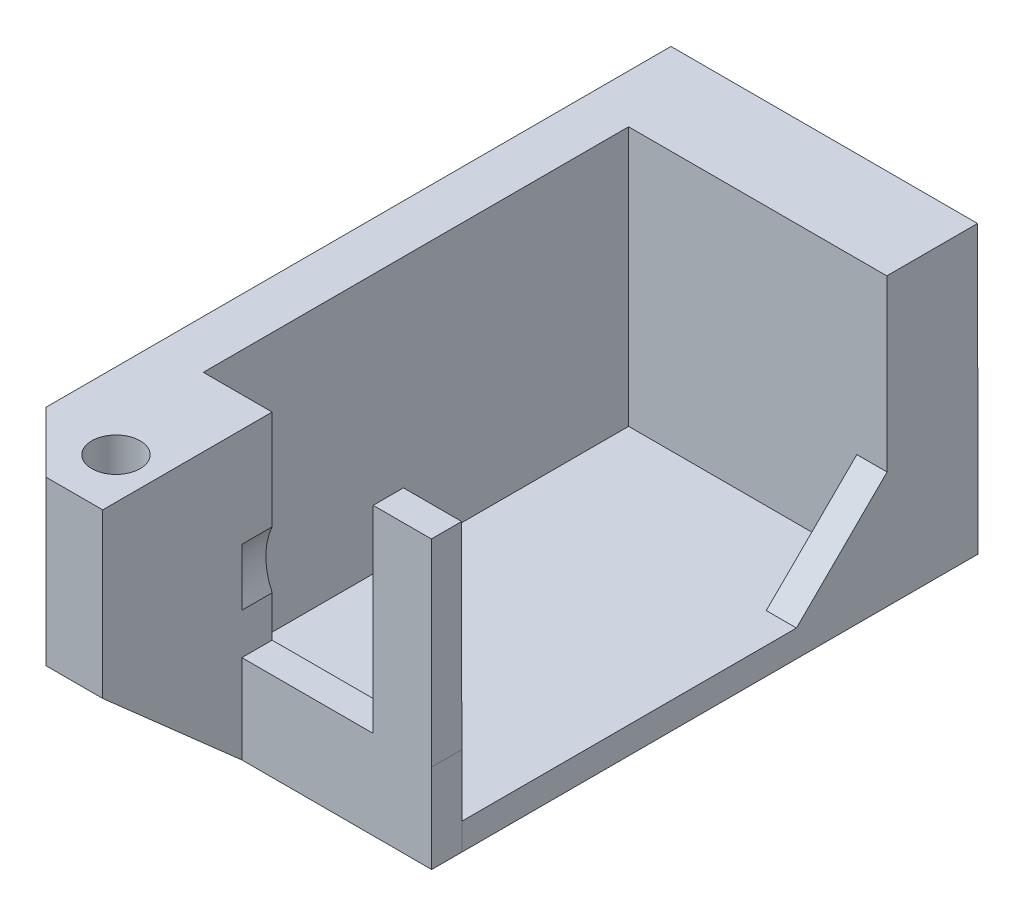
ISO-10303-21;
HEADER;
FILE_DESCRIPTION(('STEP AP214'),'2;1');
FILE_NAME('part.step','',(''),(''),'','','');
FILE_SCHEMA(('AUTOMOTIVE_DESIGN { 1 0 10303 214 1 1 1 1 }'));
ENDSEC;
DATA;
#1=APPLICATION_CONTEXT('core data for automotive mechanical design processes');
#2=APPLICATION_PROTOCOL_DEFINITION('international standard','automotive_design',2000,#1);
#3=PRODUCT_CONTEXT('',#1,'mechanical');
#4=PRODUCT('Part','Part','',(#3));
#5=PRODUCT_RELATED_PRODUCT_CATEGORY('part','',(#4));
#6=PRODUCT_DEFINITION_FORMATION('','',#4);
#7=PRODUCT_DEFINITION_CONTEXT('part definition',#1,'design');
#8=PRODUCT_DEFINITION('design','',#6,#7);
#9=PRODUCT_DEFINITION_SHAPE('','',#8);
#10=(LENGTH_UNIT() NAMED_UNIT(*) SI_UNIT(.MILLI.,.METRE.));
#11=(NAMED_UNIT(*) PLANE_ANGLE_UNIT() SI_UNIT($,.RADIAN.));
#12=(NAMED_UNIT(*) SI_UNIT($,.STERADIAN.) SOLID_ANGLE_UNIT());
#13=UNCERTAINTY_MEASURE_WITH_UNIT(LENGTH_MEASURE(1.E-05),#10,'distance_accuracy_value','');
#14=(GEOMETRIC_REPRESENTATION_CONTEXT(3) GLOBAL_UNCERTAINTY_ASSIGNED_CONTEXT((#13)) GLOBAL_UNIT_ASSIGNED_CONTEXT((#10,
#11,#12)) REPRESENTATION_CONTEXT('',''));
#15=CARTESIAN_POINT('',(0.,0.,0.));
#16=DIRECTION('',(0.,0.,1.));
#17=DIRECTION('',(1.,0.,0.));
#18=AXIS2_PLACEMENT_3D('',#15,#16,#17);
#19=CARTESIAN_POINT('',(0.,0.,0.));
#20=DIRECTION('',(0.,0.,-1.));
#21=DIRECTION('',(-1.,0.,0.));
#22=AXIS2_PLACEMENT_3D('',#19,#20,#21);
#23=PLANE('',#22);
#24=DIRECTION('',(1.,0.,0.));
#25=VECTOR('',#24,1.);
#26=CARTESIAN_POINT('',(-21.5750956135343,-21.7319684577006,0.));
#27=LINE('',#26,#25);
#28=CARTESIAN_POINT('',(-21.5750956135343,-21.7319684577006,0.));
#29=VERTEX_POINT('',#28);
#30=CARTESIAN_POINT('',(21.1677923545201,-21.7319684577006,0.));
#31=VERTEX_POINT('',#30);
#32=EDGE_CURVE('E317',#29,#31,#27,.T.);
#33=ORIENTED_EDGE('',*,*,#32,.F.);
#34=DIRECTION('',(0.,-1.,0.));
#35=VECTOR('',#34,1.);
#36=CARTESIAN_POINT('',(-21.5750956135343,21.15,0.));
#37=LINE('',#36,#35);
#38=CARTESIAN_POINT('',(-21.5750956135343,21.15,0.));
#39=VERTEX_POINT('',#38);
#40=EDGE_CURVE('E322',#39,#29,#37,.T.);
#41=ORIENTED_EDGE('',*,*,#40,.F.);
#42=DIRECTION('',(-1.,0.,0.));
#43=VECTOR('',#42,1.);
#44=CARTESIAN_POINT('',(-10.2002053653351,21.15,0.));
#45=LINE('',#44,#43);
#46=CARTESIAN_POINT('',(-10.2002053653351,21.15,0.));
#47=VERTEX_POINT('',#46);
#48=EDGE_CURVE('E249',#47,#39,#45,.T.);
#49=ORIENTED_EDGE('',*,*,#48,.F.);
#50=DIRECTION('',(0.,1.,0.));
#51=VECTOR('',#50,1.);
#52=CARTESIAN_POINT('',(-10.2002053653351,4.72173150604771,0.));
#53=LINE('',#52,#51);
#54=CARTESIAN_POINT('',(-10.2002053653351,4.72173150604772,0.));
#55=VERTEX_POINT('',#54);
#56=EDGE_CURVE('E253',#55,#47,#53,.T.);
#57=ORIENTED_EDGE('',*,*,#56,.F.);
#58=CARTESIAN_POINT('',(0.,0.,0.));
#59=DIRECTION('',(0.,0.,-1.));
#60=DIRECTION('',(-1.,0.,0.));
#61=AXIS2_PLACEMENT_3D('',#58,#59,#60);
#62=CIRCLE('',#61,11.2400595154213);
#63=CARTESIAN_POINT('',(-10.2002053653351,-4.72173150604771,0.));
#64=VERTEX_POINT('',#63);
#65=EDGE_CURVE('E255',#64,#55,#62,.T.);
#66=ORIENTED_EDGE('',*,*,#65,.F.);
#67=DIRECTION('',(0.,1.,0.));
#68=VECTOR('',#67,1.);
#69=CARTESIAN_POINT('',(-10.2002053653351,-11.5,0.));
#70=LINE('',#69,#68);
#71=CARTESIAN_POINT('',(-10.2002053653351,-11.5,0.));
#72=VERTEX_POINT('',#71);
#73=EDGE_CURVE('E257',#72,#64,#70,.T.);
#74=ORIENTED_EDGE('',*,*,#73,.F.);
#75=DIRECTION('',(-1.,0.,0.));
#76=VECTOR('',#75,1.);
#77=CARTESIAN_POINT('',(-10.2002053653351,-11.5,0.));
#78=LINE('',#77,#76);
#79=CARTESIAN_POINT('',(11.5,-11.5,0.));
#80=VERTEX_POINT('',#79);
#81=EDGE_CURVE('E259',#80,#72,#78,.T.);
#82=ORIENTED_EDGE('',*,*,#81,.F.);
#83=DIRECTION('',(0.,-1.,0.));
#84=VECTOR('',#83,1.);
#85=CARTESIAN_POINT('',(11.5,-11.5,0.));
#86=LINE('',#85,#84);
#87=CARTESIAN_POINT('',(11.5,21.15,0.));
#88=VERTEX_POINT('',#87);
#89=EDGE_CURVE('E261',#88,#80,#86,.T.);
#90=ORIENTED_EDGE('',*,*,#89,.F.);
#91=DIRECTION('',(-1.,0.,0.));
#92=VECTOR('',#91,1.);
#93=CARTESIAN_POINT('',(11.5,21.15,0.));
#94=LINE('',#93,#92);
#95=CARTESIAN_POINT('',(21.124259995829,21.15,0.));
#96=VERTEX_POINT('',#95);
#97=EDGE_CURVE('E263',#96,#88,#94,.T.);
#98=ORIENTED_EDGE('',*,*,#97,.F.);
#99=DIRECTION('',(-0.000780240586579401,0.999999695612267,0.));
#100=VECTOR('',#99,1.);
#101=CARTESIAN_POINT('',(21.124259995829,21.15,0.));
#102=LINE('',#101,#100);
#103=CARTESIAN_POINT('',(21.149734858735,-11.5,0.));
#104=VERTEX_POINT('',#103);
#105=EDGE_CURVE('E265',#104,#96,#102,.T.);
#106=ORIENTED_EDGE('',*,*,#105,.F.);
#107=DIRECTION('',(-1.,1.30852772091248E-11,0.));
#108=VECTOR('',#107,1.);
#109=CARTESIAN_POINT('',(21.15,-11.5,0.));
#110=LINE('',#109,#108);
#111=CARTESIAN_POINT('',(21.15,-11.5,0.));
#112=VERTEX_POINT('',#111);
#113=EDGE_CURVE('E267',#112,#104,#110,.T.);
#114=ORIENTED_EDGE('',*,*,#113,.F.);
#115=DIRECTION('',(-0.00173889586287371,0.999998488119446,0.));
#116=VECTOR('',#115,1.);
#117=CARTESIAN_POINT('',(21.1754748629061,-26.15,0.));
#118=LINE('',#117,#116);
#119=EDGE_CURVE('E272',#31,#112,#118,.T.);
#120=ORIENTED_EDGE('',*,*,#119,.F.);
#121=EDGE_LOOP('',(#33,#41,#49,#57,#66,#74,#82,#90,#98,#106,#114,#120));
#122=FACE_BOUND('',#121,.T.);
#123=ADVANCED_FACE('F33',(#122),#23,.T.);
#124=CARTESIAN_POINT('',(21.1754748629061,-26.15,5.));
#125=DIRECTION('',(-0.999998488119446,-0.00173889586287371,0.));
#126=DIRECTION('',(0.00173889586287371,-0.999998488119446,0.));
#127=AXIS2_PLACEMENT_3D('',#124,#125,#126);
#128=PLANE('',#127);
#129=CARTESIAN_POINT('',(21.1754748629061,-26.15,0.));
#130=VERTEX_POINT('',#129);
#131=EDGE_CURVE('E269',#130,#31,#118,.T.);
#132=ORIENTED_EDGE('',*,*,#131,.T.);
#133=ORIENTED_EDGE('',*,*,#119,.T.);
#134=DIRECTION('',(0.,0.,-1.));
#135=VECTOR('',#134,1.);
#136=CARTESIAN_POINT('',(21.15,-11.5,5.));
#137=LINE('',#136,#135);
#138=CARTESIAN_POINT('',(21.15,-11.5,5.));
#139=VERTEX_POINT('',#138);
#140=EDGE_CURVE('E214',#139,#112,#137,.T.);
#141=ORIENTED_EDGE('',*,*,#140,.F.);
#142=DIRECTION('',(-0.00173889586287371,0.999998488119446,0.));
#143=VECTOR('',#142,1.);
#144=CARTESIAN_POINT('',(21.1754748629061,-26.15,5.));
#145=LINE('',#144,#143);
#146=CARTESIAN_POINT('',(21.1754748629061,-26.15,5.));
#147=VERTEX_POINT('',#146);
#148=EDGE_CURVE('E252',#147,#139,#145,.T.);
#149=ORIENTED_EDGE('',*,*,#148,.F.);
#150=DIRECTION('',(0.,0.,-1.));
#151=VECTOR('',#150,1.);
#152=CARTESIAN_POINT('',(21.1754748629061,-26.15,5.));
#153=LINE('',#152,#151);
#154=EDGE_CURVE('E245',#147,#130,#153,.T.);
#155=ORIENTED_EDGE('',*,*,#154,.T.);
#156=EDGE_LOOP('',(#132,#133,#141,#149,#155));
#157=FACE_BOUND('',#156,.T.);
#158=ADVANCED_FACE('F368',(#157),#128,.F.);
#159=CARTESIAN_POINT('',(21.15,-11.5,5.));
#160=DIRECTION('',(-1.30852772091248E-11,-1.,0.));
#161=DIRECTION('',(1.,-1.30852772091248E-11,0.));
#162=AXIS2_PLACEMENT_3D('',#159,#160,#161);
#163=PLANE('',#162);
#164=ORIENTED_EDGE('',*,*,#113,.T.);
#165=DIRECTION('',(0.,0.,-1.));
#166=VECTOR('',#165,1.);
#167=CARTESIAN_POINT('',(21.149734858735,-11.5,5.));
#168=LINE('',#167,#166);
#169=CARTESIAN_POINT('',(21.149734858735,-11.5,5.));
#170=VERTEX_POINT('',#169);
#171=EDGE_CURVE('E217',#170,#104,#168,.T.);
#172=ORIENTED_EDGE('',*,*,#171,.F.);
#173=DIRECTION('',(-1.,1.30852772091248E-11,0.));
#174=VECTOR('',#173,1.);
#175=CARTESIAN_POINT('',(21.15,-11.5,5.));
#176=LINE('',#175,#174);
#177=EDGE_CURVE('E287',#139,#170,#176,.T.);
#178=ORIENTED_EDGE('',*,*,#177,.F.);
#179=ORIENTED_EDGE('',*,*,#140,.T.);
#180=EDGE_LOOP('',(#164,#172,#178,#179));
#181=FACE_BOUND('',#180,.T.);
#182=ADVANCED_FACE('F389',(#181),#163,.F.);
#183=CARTESIAN_POINT('',(21.124259995829,21.15,5.));
#184=DIRECTION('',(-0.999999695612267,-0.000780240586579401,0.));
#185=DIRECTION('',(0.000780240586579401,-0.999999695612267,0.));
#186=AXIS2_PLACEMENT_3D('',#183,#184,#185);
#187=PLANE('',#186);
#188=ORIENTED_EDGE('',*,*,#105,.T.);
#189=DIRECTION('',(0.,0.,-1.));
#190=VECTOR('',#189,1.);
#191=CARTESIAN_POINT('',(21.124259995829,21.15,5.));
#192=LINE('',#191,#190);
#193=CARTESIAN_POINT('',(21.124259995829,21.15,5.));
#194=VERTEX_POINT('',#193);
#195=EDGE_CURVE('E220',#194,#96,#192,.T.);
#196=ORIENTED_EDGE('',*,*,#195,.F.);
#197=DIRECTION('',(-0.000780240586579401,0.999999695612267,0.));
#198=VECTOR('',#197,1.);
#199=CARTESIAN_POINT('',(21.124259995829,21.15,5.));
#200=LINE('',#199,#198);
#201=EDGE_CURVE('E285',#170,#194,#200,.T.);
#202=ORIENTED_EDGE('',*,*,#201,.F.);
#203=ORIENTED_EDGE('',*,*,#171,.T.);
#204=EDGE_LOOP('',(#188,#196,#202,#203));
#205=FACE_BOUND('',#204,.T.);
#206=ADVANCED_FACE('F447',(#205),#187,.F.);
#207=CARTESIAN_POINT('',(11.5,21.15,5.));
#208=DIRECTION('',(0.,-1.,0.));
#209=DIRECTION('',(0.,0.,-1.));
#210=AXIS2_PLACEMENT_3D('',#207,#208,#209);
#211=PLANE('',#210);
#212=ORIENTED_EDGE('',*,*,#97,.T.);
#213=DIRECTION('',(0.,0.,-1.));
#214=VECTOR('',#213,1.);
#215=CARTESIAN_POINT('',(11.5,21.15,5.));
#216=LINE('',#215,#214);
#217=CARTESIAN_POINT('',(11.5,21.15,5.));
#218=VERTEX_POINT('',#217);
#219=EDGE_CURVE('E223',#218,#88,#216,.T.);
#220=ORIENTED_EDGE('',*,*,#219,.F.);
#221=DIRECTION('',(-1.,0.,0.));
#222=VECTOR('',#221,1.);
#223=CARTESIAN_POINT('',(11.5,21.15,5.));
#224=LINE('',#223,#222);
#225=EDGE_CURVE('E283',#194,#218,#224,.T.);
#226=ORIENTED_EDGE('',*,*,#225,.F.);
#227=ORIENTED_EDGE('',*,*,#195,.T.);
#228=EDGE_LOOP('',(#212,#220,#226,#227));
#229=FACE_BOUND('',#228,.T.);
#230=ADVANCED_FACE('F443',(#229),#211,.F.);
#231=CARTESIAN_POINT('',(11.5,-11.5,5.));
#232=DIRECTION('',(1.,0.,0.));
#233=DIRECTION('',(0.,0.,-1.));
#234=AXIS2_PLACEMENT_3D('',#231,#232,#233);
#235=PLANE('',#234);
#236=ORIENTED_EDGE('',*,*,#89,.T.);
#237=DIRECTION('',(0.,0.,-1.));
#238=VECTOR('',#237,1.);
#239=CARTESIAN_POINT('',(11.5,-11.5,5.));
#240=LINE('',#239,#238);
#241=CARTESIAN_POINT('',(11.5,-11.5,5.));
#242=VERTEX_POINT('',#241);
#243=EDGE_CURVE('E226',#242,#80,#240,.T.);
#244=ORIENTED_EDGE('',*,*,#243,.F.);
#245=DIRECTION('',(0.,-1.,0.));
#246=VECTOR('',#245,1.);
#247=CARTESIAN_POINT('',(11.5,-11.5,5.));
#248=LINE('',#247,#246);
#249=EDGE_CURVE('E281',#218,#242,#248,.T.);
#250=ORIENTED_EDGE('',*,*,#249,.F.);
#251=ORIENTED_EDGE('',*,*,#219,.T.);
#252=EDGE_LOOP('',(#236,#244,#250,#251));
#253=FACE_BOUND('',#252,.T.);
#254=ADVANCED_FACE('F439',(#253),#235,.F.);
#255=CARTESIAN_POINT('',(-10.2002053653351,-11.5,5.));
#256=DIRECTION('',(0.,-1.,0.));
#257=DIRECTION('',(0.,0.,-1.));
#258=AXIS2_PLACEMENT_3D('',#255,#256,#257);
#259=PLANE('',#258);
#260=ORIENTED_EDGE('',*,*,#81,.T.);
#261=DIRECTION('',(0.,0.,-1.));
#262=VECTOR('',#261,1.);
#263=CARTESIAN_POINT('',(-10.2002053653351,-11.5,5.));
#264=LINE('',#263,#262);
#265=CARTESIAN_POINT('',(-10.2002053653351,-11.5,5.));
#266=VERTEX_POINT('',#265);
#267=EDGE_CURVE('E229',#266,#72,#264,.T.);
#268=ORIENTED_EDGE('',*,*,#267,.F.);
#269=DIRECTION('',(-1.,0.,0.));
#270=VECTOR('',#269,1.);
#271=CARTESIAN_POINT('',(-10.2002053653351,-11.5,5.));
#272=LINE('',#271,#270);
#273=EDGE_CURVE('E279',#242,#266,#272,.T.);
#274=ORIENTED_EDGE('',*,*,#273,.F.);
#275=ORIENTED_EDGE('',*,*,#243,.T.);
#276=EDGE_LOOP('',(#260,#268,#274,#275));
#277=FACE_BOUND('',#276,.T.);
#278=ADVANCED_FACE('F435',(#277),#259,.F.);
#279=CARTESIAN_POINT('',(0.,0.,5.));
#280=DIRECTION('',(0.,0.,-1.));
#281=DIRECTION('',(-1.,0.,0.));
#282=AXIS2_PLACEMENT_3D('',#279,#280,#281);
#283=CYLINDRICAL_SURFACE('',#282,11.2400595154213);
#284=ORIENTED_EDGE('',*,*,#65,.T.);
#285=DIRECTION('',(0.,0.,-1.));
#286=VECTOR('',#285,1.);
#287=CARTESIAN_POINT('',(-10.2002053653351,4.72173150604772,5.));
#288=LINE('',#287,#286);
#289=CARTESIAN_POINT('',(-10.2002053653351,4.72173150604772,5.));
#290=VERTEX_POINT('',#289);
#291=EDGE_CURVE('E235',#290,#55,#288,.T.);
#292=ORIENTED_EDGE('',*,*,#291,.F.);
#293=CARTESIAN_POINT('',(0.,0.,5.));
#294=DIRECTION('',(0.,0.,-1.));
#295=DIRECTION('',(-1.,0.,0.));
#296=AXIS2_PLACEMENT_3D('',#293,#294,#295);
#297=CIRCLE('',#296,11.2400595154213);
#298=CARTESIAN_POINT('',(-10.2002053653351,-4.72173150604771,5.));
#299=VERTEX_POINT('',#298);
#300=EDGE_CURVE('E276',#299,#290,#297,.T.);
#301=ORIENTED_EDGE('',*,*,#300,.F.);
#302=DIRECTION('',(0.,0.,-1.));
#303=VECTOR('',#302,1.);
#304=CARTESIAN_POINT('',(-10.2002053653351,-4.72173150604771,5.));
#305=LINE('',#304,#303);
#306=EDGE_CURVE('E232',#299,#64,#305,.T.);
#307=ORIENTED_EDGE('',*,*,#306,.T.);
#308=EDGE_LOOP('',(#284,#292,#301,#307));
#309=FACE_BOUND('',#308,.T.);
#310=ADVANCED_FACE('F432',(#309),#283,.F.);
#311=CARTESIAN_POINT('',(-10.2002053653351,4.72173150604771,5.));
#312=DIRECTION('',(-1.,0.,0.));
#313=DIRECTION('',(0.,-1.,0.));
#314=AXIS2_PLACEMENT_3D('',#311,#312,#313);
#315=PLANE('',#314);
#316=ORIENTED_EDGE('',*,*,#56,.T.);
#317=DIRECTION('',(0.,0.,-1.));
#318=VECTOR('',#317,1.);
#319=CARTESIAN_POINT('',(-10.2002053653351,21.15,5.));
#320=LINE('',#319,#318);
#321=CARTESIAN_POINT('',(-10.2002053653351,21.15,28.));
#322=VERTEX_POINT('',#321);
#323=EDGE_CURVE('E238',#322,#47,#320,.T.);
#324=ORIENTED_EDGE('',*,*,#323,.F.);
#325=DIRECTION('',(0.,1.,0.));
#326=VECTOR('',#325,1.);
#327=CARTESIAN_POINT('',(-10.2002053653351,21.15,28.));
#328=LINE('',#327,#326);
#329=CARTESIAN_POINT('',(-10.2002053653351,-5.85,28.));
#330=VERTEX_POINT('',#329);
#331=EDGE_CURVE('E294',#330,#322,#328,.T.);
#332=ORIENTED_EDGE('',*,*,#331,.F.);
#333=DIRECTION('',(0.,0.661729443022599,0.749742718695555));
#334=VECTOR('',#333,1.);
#335=CARTESIAN_POINT('',(-10.2002053653351,-5.85,28.));
#336=LINE('',#335,#334);
#337=CARTESIAN_POINT('',(-10.2002053653351,-26.15,5.));
#338=VERTEX_POINT('',#337);
#339=EDGE_CURVE('E301',#338,#330,#336,.T.);
#340=ORIENTED_EDGE('',*,*,#339,.F.);
#341=DIRECTION('',(0.,-1.,0.));
#342=VECTOR('',#341,1.);
#343=CARTESIAN_POINT('',(-10.2002053653351,0.,5.));
#344=LINE('',#343,#342);
#345=EDGE_CURVE('E204',#266,#338,#344,.T.);
#346=ORIENTED_EDGE('',*,*,#345,.F.);
#347=ORIENTED_EDGE('',*,*,#267,.T.);
#348=ORIENTED_EDGE('',*,*,#73,.T.);
#349=ORIENTED_EDGE('',*,*,#306,.F.);
#350=DIRECTION('',(0.,-1.,0.));
#351=VECTOR('',#350,1.);
#352=CARTESIAN_POINT('',(-10.2002053653351,-26.15,5.));
#353=LINE('',#352,#351);
#354=EDGE_CURVE('E298',#290,#299,#353,.T.);
#355=ORIENTED_EDGE('',*,*,#354,.F.);
#356=ORIENTED_EDGE('',*,*,#291,.T.);
#357=EDGE_LOOP('',(#316,#324,#332,#340,#346,#347,#348,#349,#355,#356));
#358=FACE_BOUND('',#357,.T.);
#359=ADVANCED_FACE('F399',(#358),#315,.F.);
#360=CARTESIAN_POINT('',(-10.2002053653351,21.15,5.));
#361=DIRECTION('',(0.,-1.,0.));
#362=DIRECTION('',(0.,0.,-1.));
#363=AXIS2_PLACEMENT_3D('',#360,#361,#362);
#364=PLANE('',#363);
#365=CARTESIAN_POINT('',(-16.9999999999998,21.15,19.0131143658327));
#366=DIRECTION('',(0.,1.,0.));
#367=DIRECTION('',(0.,0.,1.));
#368=AXIS2_PLACEMENT_3D('',#365,#366,#367);
#369=CIRCLE('',#368,3.9999356730528);
#370=CARTESIAN_POINT('',(-16.9999999999998,21.15,23.0130500388855));
#371=VERTEX_POINT('',#370);
#372=EDGE_CURVE('E212',#371,#371,#369,.T.);
#373=ORIENTED_EDGE('',*,*,#372,.F.);
#374=EDGE_LOOP('',(#373));
#375=FACE_BOUND('',#374,.T.);
#376=DIRECTION('',(0.,0.,-1.));
#377=VECTOR('',#376,1.);
#378=CARTESIAN_POINT('',(-29.5750956135343,21.15,5.));
#379=LINE('',#378,#377);
#380=CARTESIAN_POINT('',(-29.5750956135343,21.15,18.));
#381=VERTEX_POINT('',#380);
#382=CARTESIAN_POINT('',(-29.5750956135343,21.15,-85.3000000000005));
#383=VERTEX_POINT('',#382);
#384=EDGE_CURVE('E241',#381,#383,#379,.T.);
#385=ORIENTED_EDGE('',*,*,#384,.F.);
#386=DIRECTION('',(0.707106781186548,0.,0.707106781186547));
#387=VECTOR('',#386,1.);
#388=CARTESIAN_POINT('',(-29.5750956135343,21.15,18.));
#389=LINE('',#388,#387);
#390=CARTESIAN_POINT('',(-19.5750956135343,21.15,28.));
#391=VERTEX_POINT('',#390);
#392=EDGE_CURVE('E55',#381,#391,#389,.T.);
#393=ORIENTED_EDGE('',*,*,#392,.T.);
#394=DIRECTION('',(-1.,0.,0.));
#395=VECTOR('',#394,1.);
#396=CARTESIAN_POINT('',(-10.2002053653351,21.15,28.));
#397=LINE('',#396,#395);
#398=EDGE_CURVE('E293',#322,#391,#397,.T.);
#399=ORIENTED_EDGE('',*,*,#398,.F.);
#400=ORIENTED_EDGE('',*,*,#323,.T.);
#401=ORIENTED_EDGE('',*,*,#48,.T.);
#402=DIRECTION('',(0.,0.,1.));
#403=VECTOR('',#402,1.);
#404=CARTESIAN_POINT('',(-21.5750956135343,21.15,-85.3000000000005));
#405=LINE('',#404,#403);
#406=CARTESIAN_POINT('',(-21.5750956135343,21.15,-70.3000000000005));
#407=VERTEX_POINT('',#406);
#408=EDGE_CURVE('E310',#407,#39,#405,.T.);
#409=ORIENTED_EDGE('',*,*,#408,.F.);
#410=DIRECTION('',(1.,0.,0.));
#411=VECTOR('',#410,1.);
#412=CARTESIAN_POINT('',(21.1022286511894,21.15,-70.3000000000005));
#413=LINE('',#412,#411);
#414=CARTESIAN_POINT('',(21.1022286511894,21.15,-70.3000000000005));
#415=VERTEX_POINT('',#414);
#416=EDGE_CURVE('E344',#407,#415,#413,.T.);
#417=ORIENTED_EDGE('',*,*,#416,.T.);
#418=DIRECTION('',(0.,0.,-1.));
#419=VECTOR('',#418,1.);
#420=CARTESIAN_POINT('',(21.1022286511894,21.15,-70.3000000000005));
#421=LINE('',#420,#419);
#422=CARTESIAN_POINT('',(21.1022286511894,21.15,-85.3000000000005));
#423=VERTEX_POINT('',#422);
#424=EDGE_CURVE('E341',#415,#423,#421,.T.);
#425=ORIENTED_EDGE('',*,*,#424,.T.);
#426=DIRECTION('',(1.,0.,0.));
#427=VECTOR('',#426,1.);
#428=CARTESIAN_POINT('',(-29.5750956135343,21.15,-85.3000000000005));
#429=LINE('',#428,#427);
#430=EDGE_CURVE('E316',#383,#423,#429,.T.);
#431=ORIENTED_EDGE('',*,*,#430,.F.);
#432=EDGE_LOOP('',(#385,#393,#399,#400,#401,#409,#417,#425,#431));
#433=FACE_BOUND('',#432,.T.);
#434=ADVANCED_FACE('F378',(#375,#433),#364,.F.);
#435=CARTESIAN_POINT('',(-29.5750956135343,-26.15,5.));
#436=DIRECTION('',(1.,0.,0.));
#437=DIRECTION('',(0.,0.,-1.));
#438=AXIS2_PLACEMENT_3D('',#435,#436,#437);
#439=PLANE('',#438);
#440=DIRECTION('',(0.,0.661729443022599,0.749742718695555));
#441=VECTOR('',#440,1.);
#442=CARTESIAN_POINT('',(-29.5750956135343,-5.85,28.));
#443=LINE('',#442,#441);
#444=CARTESIAN_POINT('',(-29.5750956135343,-26.15,5.));
#445=VERTEX_POINT('',#444);
#446=CARTESIAN_POINT('',(-29.5750956135343,-14.6760869565217,18.));
#447=VERTEX_POINT('',#446);
#448=EDGE_CURVE('E211',#445,#447,#443,.T.);
#449=ORIENTED_EDGE('',*,*,#448,.T.);
#450=DIRECTION('',(0.,1.,0.));
#451=VECTOR('',#450,1.);
#452=CARTESIAN_POINT('',(-29.5750956135343,21.15,18.));
#453=LINE('',#452,#451);
#454=EDGE_CURVE('E200',#447,#381,#453,.T.);
#455=ORIENTED_EDGE('',*,*,#454,.T.);
#456=ORIENTED_EDGE('',*,*,#384,.T.);
#457=DIRECTION('',(0.,1.,0.));
#458=VECTOR('',#457,1.);
#459=CARTESIAN_POINT('',(-29.5750956135343,-26.15,-85.3000000000005));
#460=LINE('',#459,#458);
#461=CARTESIAN_POINT('',(-29.5750956135343,-26.15,-85.3000000000005));
#462=VERTEX_POINT('',#461);
#463=EDGE_CURVE('E331',#462,#383,#460,.T.);
#464=ORIENTED_EDGE('',*,*,#463,.F.);
#465=DIRECTION('',(0.,0.,-1.));
#466=VECTOR('',#465,1.);
#467=CARTESIAN_POINT('',(-29.5750956135343,-26.15,5.));
#468=LINE('',#467,#466);
#469=EDGE_CURVE('E243',#445,#462,#468,.T.);
#470=ORIENTED_EDGE('',*,*,#469,.F.);
#471=EDGE_LOOP('',(#449,#455,#456,#464,#470));
#472=FACE_BOUND('',#471,.T.);
#473=ADVANCED_FACE('F407',(#472),#439,.F.);
#474=CARTESIAN_POINT('',(21.1754748629061,-26.15,5.));
#475=DIRECTION('',(0.,1.,0.));
#476=DIRECTION('',(0.,0.,1.));
#477=AXIS2_PLACEMENT_3D('',#474,#475,#476);
#478=PLANE('',#477);
#479=ORIENTED_EDGE('',*,*,#469,.T.);
#480=DIRECTION('',(-1.,0.,0.));
#481=VECTOR('',#480,1.);
#482=CARTESIAN_POINT('',(21.1754748629061,-26.15,-85.3000000000005));
#483=LINE('',#482,#481);
#484=CARTESIAN_POINT('',(21.1754748629061,-26.15,-85.3000000000005));
#485=VERTEX_POINT('',#484);
#486=EDGE_CURVE('E334',#485,#462,#483,.T.);
#487=ORIENTED_EDGE('',*,*,#486,.F.);
#488=DIRECTION('',(0.,0.,1.));
#489=VECTOR('',#488,1.);
#490=CARTESIAN_POINT('',(21.1754748629061,-26.15,-85.3000000000005));
#491=LINE('',#490,#489);
#492=EDGE_CURVE('E308',#485,#130,#491,.T.);
#493=ORIENTED_EDGE('',*,*,#492,.T.);
#494=ORIENTED_EDGE('',*,*,#154,.F.);
#495=DIRECTION('',(1.,0.,0.));
#496=VECTOR('',#495,1.);
#497=CARTESIAN_POINT('',(-21.15,-26.15,5.));
#498=LINE('',#497,#496);
#499=EDGE_CURVE('E275',#338,#147,#498,.T.);
#500=ORIENTED_EDGE('',*,*,#499,.F.);
#501=EDGE_CURVE('E248',#445,#338,#498,.T.);
#502=ORIENTED_EDGE('',*,*,#501,.F.);
#503=EDGE_LOOP('',(#479,#487,#493,#494,#500,#502));
#504=FACE_BOUND('',#503,.T.);
#505=ADVANCED_FACE('F372',(#504),#478,.F.);
#506=CARTESIAN_POINT('',(0.,0.,5.));
#507=DIRECTION('',(0.,0.,-1.));
#508=DIRECTION('',(-1.,0.,0.));
#509=AXIS2_PLACEMENT_3D('',#506,#507,#508);
#510=PLANE('',#509);
#511=ORIENTED_EDGE('',*,*,#273,.T.);
#512=ORIENTED_EDGE('',*,*,#345,.T.);
#513=ORIENTED_EDGE('',*,*,#499,.T.);
#514=ORIENTED_EDGE('',*,*,#148,.T.);
#515=ORIENTED_EDGE('',*,*,#177,.T.);
#516=ORIENTED_EDGE('',*,*,#201,.T.);
#517=ORIENTED_EDGE('',*,*,#225,.T.);
#518=ORIENTED_EDGE('',*,*,#249,.T.);
#519=EDGE_LOOP('',(#511,#512,#513,#514,#515,#516,#517,#518));
#520=FACE_BOUND('',#519,.T.);
#521=ADVANCED_FACE('F393',(#520),#510,.F.);
#522=CARTESIAN_POINT('',(-10.2002053653351,-26.15,5.));
#523=DIRECTION('',(0.,0.,-1.));
#524=DIRECTION('',(-1.,0.,0.));
#525=AXIS2_PLACEMENT_3D('',#522,#523,#524);
#526=PLANE('',#525);
#527=ORIENTED_EDGE('',*,*,#300,.T.);
#528=ORIENTED_EDGE('',*,*,#354,.T.);
#529=EDGE_LOOP('',(#527,#528));
#530=FACE_BOUND('',#529,.T.);
#531=ADVANCED_FACE('F503',(#530),#526,.T.);
#532=CARTESIAN_POINT('',(-10.2002053653351,21.15,28.));
#533=DIRECTION('',(0.,0.,1.));
#534=DIRECTION('',(1.,0.,0.));
#535=AXIS2_PLACEMENT_3D('',#532,#533,#534);
#536=PLANE('',#535);
#537=ORIENTED_EDGE('',*,*,#398,.T.);
#538=DIRECTION('',(0.,-1.,0.));
#539=VECTOR('',#538,1.);
#540=CARTESIAN_POINT('',(-19.5750956135343,-5.85,28.));
#541=LINE('',#540,#539);
#542=CARTESIAN_POINT('',(-19.5750956135343,-5.85,28.));
#543=VERTEX_POINT('',#542);
#544=EDGE_CURVE('E41',#391,#543,#541,.T.);
#545=ORIENTED_EDGE('',*,*,#544,.T.);
#546=DIRECTION('',(-1.,0.,0.));
#547=VECTOR('',#546,1.);
#548=CARTESIAN_POINT('',(-10.2002053653351,-5.85,28.));
#549=LINE('',#548,#547);
#550=EDGE_CURVE('E291',#330,#543,#549,.T.);
#551=ORIENTED_EDGE('',*,*,#550,.F.);
#552=ORIENTED_EDGE('',*,*,#331,.T.);
#553=EDGE_LOOP('',(#537,#545,#551,#552));
#554=FACE_BOUND('',#553,.T.);
#555=ADVANCED_FACE('F509',(#554),#536,.T.);
#556=CARTESIAN_POINT('',(-10.2002053653351,-5.85,28.));
#557=DIRECTION('',(0.,-0.749742718695555,0.661729443022599));
#558=DIRECTION('',(0.,-0.661729443022599,-0.749742718695555));
#559=AXIS2_PLACEMENT_3D('',#556,#557,#558);
#560=PLANE('',#559);
#561=CARTESIAN_POINT('',(-16.9999999999998,-13.7819034075477,19.0131143658327));
#562=DIRECTION('',(0.,-0.749742718695555,0.661729443022599));
#563=DIRECTION('',(0.,0.661729443022599,0.749742718695555));
#564=AXIS2_PLACEMENT_3D('',#561,#562,#563);
#565=ELLIPSE('',#564,5.33507771841001,3.9999356730528);
#566=CARTESIAN_POINT('',(-16.9999999999998,-10.2515254004619,23.0130500388855));
#567=VERTEX_POINT('',#566);
#568=EDGE_CURVE('E208',#567,#567,#565,.T.);
#569=ORIENTED_EDGE('',*,*,#568,.F.);
#570=EDGE_LOOP('',(#569));
#571=FACE_BOUND('',#570,.T.);
#572=ORIENTED_EDGE('',*,*,#550,.T.);
#573=DIRECTION('',(-0.599868247568258,-0.529448931549375,-0.599868247568257));
#574=VECTOR('',#573,1.);
#575=CARTESIAN_POINT('',(-16.2016171589517,-2.87253858139009,31.3734784545827));
#576=LINE('',#575,#574);
#577=EDGE_CURVE('E11',#543,#447,#576,.T.);
#578=ORIENTED_EDGE('',*,*,#577,.T.);
#579=ORIENTED_EDGE('',*,*,#448,.F.);
#580=ORIENTED_EDGE('',*,*,#501,.T.);
#581=ORIENTED_EDGE('',*,*,#339,.T.);
#582=EDGE_LOOP('',(#572,#578,#579,#580,#581));
#583=FACE_BOUND('',#582,.T.);
#584=ADVANCED_FACE('F403',(#571,#583),#560,.T.);
#585=CARTESIAN_POINT('',(-16.9999999999998,-23.85,19.0131143658327));
#586=DIRECTION('',(0.,1.,0.));
#587=DIRECTION('',(0.,0.,1.));
#588=AXIS2_PLACEMENT_3D('',#585,#586,#587);
#589=CYLINDRICAL_SURFACE('',#588,3.9999356730528);
#590=ORIENTED_EDGE('',*,*,#568,.T.);
#591=EDGE_LOOP('',(#590));
#592=FACE_BOUND('',#591,.T.);
#593=ORIENTED_EDGE('',*,*,#372,.T.);
#594=EDGE_LOOP('',(#593));
#595=FACE_BOUND('',#594,.T.);
#596=ADVANCED_FACE('F522',(#592,#595),#589,.F.);
#597=CARTESIAN_POINT('',(0.,0.,0.));
#598=DIRECTION('',(0.,0.,-1.));
#599=DIRECTION('',(-1.,0.,0.));
#600=AXIS2_PLACEMENT_3D('',#597,#598,#599);
#601=PLANE('',#600);
#602=CARTESIAN_POINT('',(21.1686333391488,-21.7319684577006,0.));
#603=VERTEX_POINT('',#602);
#604=EDGE_CURVE('E321',#31,#603,#27,.T.);
#605=ORIENTED_EDGE('',*,*,#604,.F.);
#606=ORIENTED_EDGE('',*,*,#131,.F.);
#607=DIRECTION('',(0.00154854384555654,-0.99999880100526,0.));
#608=VECTOR('',#607,1.);
#609=CARTESIAN_POINT('',(21.1686333391488,-21.7319684577006,0.));
#610=LINE('',#609,#608);
#611=EDGE_CURVE('E325',#603,#130,#610,.T.);
#612=ORIENTED_EDGE('',*,*,#611,.F.);
#613=EDGE_LOOP('',(#605,#606,#612));
#614=FACE_BOUND('',#613,.T.);
#615=ADVANCED_FACE('F363',(#614),#601,.F.);
#616=CARTESIAN_POINT('',(21.1686333391488,-21.7319684577006,-85.3000000000005));
#617=DIRECTION('',(-0.99999880100526,-0.00154854384555654,0.));
#618=DIRECTION('',(0.00154854384555654,-0.99999880100526,0.));
#619=AXIS2_PLACEMENT_3D('',#616,#617,#618);
#620=PLANE('',#619);
#621=DIRECTION('',(0.00108853742609013,-0.702941750124143,0.711246589460139));
#622=VECTOR('',#621,1.);
#623=CARTESIAN_POINT('',(21.1686333391488,-21.7319684577006,-55.3));
#624=LINE('',#623,#622);
#625=CARTESIAN_POINT('',(21.1456763764957,-6.90711529409461,-70.3));
#626=VERTEX_POINT('',#625);
#627=CARTESIAN_POINT('',(21.1686333391488,-21.7319684577006,-55.3));
#628=VERTEX_POINT('',#627);
#629=EDGE_CURVE('E184',#626,#628,#624,.T.);
#630=ORIENTED_EDGE('',*,*,#629,.T.);
#631=DIRECTION('',(0.,0.,1.));
#632=VECTOR('',#631,1.);
#633=CARTESIAN_POINT('',(21.1686333391488,-21.7319684577006,-85.3000000000005));
#634=LINE('',#633,#632);
#635=EDGE_CURVE('E314',#628,#603,#634,.T.);
#636=ORIENTED_EDGE('',*,*,#635,.T.);
#637=ORIENTED_EDGE('',*,*,#611,.T.);
#638=ORIENTED_EDGE('',*,*,#492,.F.);
#639=DIRECTION('',(0.00154854384555654,-0.99999880100526,0.));
#640=VECTOR('',#639,1.);
#641=CARTESIAN_POINT('',(21.1686333391488,-21.7319684577006,-85.3000000000005));
#642=LINE('',#641,#640);
#643=EDGE_CURVE('E320',#423,#485,#642,.T.);
#644=ORIENTED_EDGE('',*,*,#643,.F.);
#645=ORIENTED_EDGE('',*,*,#424,.F.);
#646=DIRECTION('',(0.00154854384555654,-0.99999880100526,0.));
#647=VECTOR('',#646,1.);
#648=CARTESIAN_POINT('',(21.1754748629061,-26.15,-70.3000000000005));
#649=LINE('',#648,#647);
#650=EDGE_CURVE('E346',#415,#626,#649,.T.);
#651=ORIENTED_EDGE('',*,*,#650,.T.);
#652=EDGE_LOOP('',(#630,#636,#637,#638,#644,#645,#651));
#653=FACE_BOUND('',#652,.T.);
#654=ADVANCED_FACE('F353',(#653),#620,.F.);
#655=CARTESIAN_POINT('',(-21.5750956135343,21.15,-85.3000000000005));
#656=DIRECTION('',(-1.,0.,0.));
#657=DIRECTION('',(0.,0.,1.));
#658=AXIS2_PLACEMENT_3D('',#655,#656,#657);
#659=PLANE('',#658);
#660=DIRECTION('',(0.,0.,1.));
#661=VECTOR('',#660,1.);
#662=CARTESIAN_POINT('',(-21.5750956135343,-21.7319684577006,-85.3000000000005));
#663=LINE('',#662,#661);
#664=CARTESIAN_POINT('',(-21.5750956135343,-21.7319684577006,-70.3000000000005));
#665=VERTEX_POINT('',#664);
#666=EDGE_CURVE('E312',#665,#29,#663,.T.);
#667=ORIENTED_EDGE('',*,*,#666,.F.);
#668=DIRECTION('',(0.,1.,0.));
#669=VECTOR('',#668,1.);
#670=CARTESIAN_POINT('',(-21.5750956135343,21.15,-70.3000000000005));
#671=LINE('',#670,#669);
#672=EDGE_CURVE('E328',#665,#407,#671,.T.);
#673=ORIENTED_EDGE('',*,*,#672,.T.);
#674=ORIENTED_EDGE('',*,*,#408,.T.);
#675=ORIENTED_EDGE('',*,*,#40,.T.);
#676=EDGE_LOOP('',(#667,#673,#674,#675));
#677=FACE_BOUND('',#676,.T.);
#678=ADVANCED_FACE('F382',(#677),#659,.F.);
#679=CARTESIAN_POINT('',(-21.5750956135343,-21.7319684577006,-85.3000000000005));
#680=DIRECTION('',(0.,-1.,0.));
#681=DIRECTION('',(0.,0.,-1.));
#682=AXIS2_PLACEMENT_3D('',#679,#680,#681);
#683=PLANE('',#682);
#684=ORIENTED_EDGE('',*,*,#635,.F.);
#685=DIRECTION('',(-0.999998772513022,0.,-0.00156683516958574));
#686=VECTOR('',#685,1.);
#687=CARTESIAN_POINT('',(-21.6219956762469,-21.7319684577006,-55.3670459447681));
#688=LINE('',#687,#686);
#689=CARTESIAN_POINT('',(16.1686273441679,-21.7319684577006,-55.3078341948575));
#690=VERTEX_POINT('',#689);
#691=EDGE_CURVE('E348',#628,#690,#688,.T.);
#692=ORIENTED_EDGE('',*,*,#691,.T.);
#693=DIRECTION('',(0.,0.,-1.));
#694=VECTOR('',#693,1.);
#695=CARTESIAN_POINT('',(16.1686273441679,-21.7319684577006,-85.3000000000005));
#696=LINE('',#695,#694);
#697=CARTESIAN_POINT('',(16.1686273441679,-21.7319684577006,-70.3));
#698=VERTEX_POINT('',#697);
#699=EDGE_CURVE('E189',#690,#698,#696,.T.);
#700=ORIENTED_EDGE('',*,*,#699,.T.);
#701=DIRECTION('',(-1.,0.,0.));
#702=VECTOR('',#701,1.);
#703=CARTESIAN_POINT('',(-21.5750956135343,-21.7319684577006,-70.3000000000005));
#704=LINE('',#703,#702);
#705=EDGE_CURVE('E199',#698,#665,#704,.T.);
#706=ORIENTED_EDGE('',*,*,#705,.T.);
#707=ORIENTED_EDGE('',*,*,#666,.T.);
#708=ORIENTED_EDGE('',*,*,#32,.T.);
#709=ORIENTED_EDGE('',*,*,#604,.T.);
#710=EDGE_LOOP('',(#684,#692,#700,#706,#707,#708,#709));
#711=FACE_BOUND('',#710,.T.);
#712=ADVANCED_FACE('F357',(#711),#683,.F.);
#713=CARTESIAN_POINT('',(0.,0.,-85.3000000000005));
#714=DIRECTION('',(0.,0.,-1.));
#715=DIRECTION('',(-1.,0.,0.));
#716=AXIS2_PLACEMENT_3D('',#713,#714,#715);
#717=PLANE('',#716);
#718=ORIENTED_EDGE('',*,*,#643,.T.);
#719=ORIENTED_EDGE('',*,*,#486,.T.);
#720=ORIENTED_EDGE('',*,*,#463,.T.);
#721=ORIENTED_EDGE('',*,*,#430,.T.);
#722=EDGE_LOOP('',(#718,#719,#720,#721));
#723=FACE_BOUND('',#722,.T.);
#724=ADVANCED_FACE('F376',(#723),#717,.T.);
#725=CARTESIAN_POINT('',(0.,0.,-70.3000000000005));
#726=DIRECTION('',(0.,0.,1.));
#727=DIRECTION('',(1.,0.,0.));
#728=AXIS2_PLACEMENT_3D('',#725,#726,#727);
#729=PLANE('',#728);
#730=DIRECTION('',(0.99999880100526,0.00154854384555654,0.));
#731=VECTOR('',#730,1.);
#732=CARTESIAN_POINT('',(16.1456823714694,-6.9148580133224,-70.3));
#733=LINE('',#732,#731);
#734=CARTESIAN_POINT('',(16.1456823714694,-6.9148580133224,-70.3));
#735=VERTEX_POINT('',#734);
#736=EDGE_CURVE('E178',#735,#626,#733,.T.);
#737=ORIENTED_EDGE('',*,*,#736,.T.);
#738=ORIENTED_EDGE('',*,*,#650,.F.);
#739=ORIENTED_EDGE('',*,*,#416,.F.);
#740=ORIENTED_EDGE('',*,*,#672,.F.);
#741=ORIENTED_EDGE('',*,*,#705,.F.);
#742=DIRECTION('',(0.00154854384555654,-0.999998801005261,0.));
#743=VECTOR('',#742,1.);
#744=CARTESIAN_POINT('',(16.1349357063356,0.0249856853442017,-70.3000000000005));
#745=LINE('',#744,#743);
#746=EDGE_CURVE('E193',#735,#698,#745,.T.);
#747=ORIENTED_EDGE('',*,*,#746,.F.);
#748=EDGE_LOOP('',(#737,#738,#739,#740,#741,#747));
#749=FACE_BOUND('',#748,.T.);
#750=ADVANCED_FACE('F197',(#749),#729,.T.);
#751=CARTESIAN_POINT('',(16.1686393341225,-21.7397111769284,-55.3));
#752=DIRECTION('',(-0.00110139652878158,0.71124573667922,0.702942592948614));
#753=DIRECTION('',(0.,-0.702943019309804,0.711246168076579));
#754=AXIS2_PLACEMENT_3D('',#751,#752,#753);
#755=PLANE('',#754);
#756=ORIENTED_EDGE('',*,*,#691,.F.);
#757=ORIENTED_EDGE('',*,*,#629,.F.);
#758=ORIENTED_EDGE('',*,*,#736,.F.);
#759=DIRECTION('',(0.00108853742609013,-0.702941750124143,0.711246589460139));
#760=VECTOR('',#759,1.);
#761=CARTESIAN_POINT('',(16.1686393341225,-21.7397111769284,-55.3));
#762=LINE('',#761,#760);
#763=EDGE_CURVE('E181',#735,#690,#762,.T.);
#764=ORIENTED_EDGE('',*,*,#763,.T.);
#765=EDGE_LOOP('',(#756,#757,#758,#764));
#766=FACE_BOUND('',#765,.T.);
#767=ADVANCED_FACE('F180',(#766),#755,.T.);
#768=CARTESIAN_POINT('',(16.1349357063356,0.0249856853442018,0.));
#769=DIRECTION('',(-0.999998801005261,-0.00154854384555654,0.));
#770=DIRECTION('',(0.00154854384555654,-0.999998801005261,0.));
#771=AXIS2_PLACEMENT_3D('',#768,#769,#770);
#772=PLANE('',#771);
#773=ORIENTED_EDGE('',*,*,#699,.F.);
#774=ORIENTED_EDGE('',*,*,#763,.F.);
#775=ORIENTED_EDGE('',*,*,#746,.T.);
#776=EDGE_LOOP('',(#773,#774,#775));
#777=FACE_BOUND('',#776,.T.);
#778=ADVANCED_FACE('F192',(#777),#772,.T.);
#779=CARTESIAN_POINT('',(-29.5750956135343,-26.15,18.));
#780=DIRECTION('',(-0.707106781186547,0.,0.707106781186548));
#781=DIRECTION('',(0.,-1.,0.));
#782=AXIS2_PLACEMENT_3D('',#779,#780,#781);
#783=PLANE('',#782);
#784=ORIENTED_EDGE('',*,*,#577,.F.);
#785=ORIENTED_EDGE('',*,*,#544,.F.);
#786=ORIENTED_EDGE('',*,*,#392,.F.);
#787=ORIENTED_EDGE('',*,*,#454,.F.);
#788=EDGE_LOOP('',(#784,#785,#786,#787));
#789=FACE_BOUND('',#788,.T.);
#790=ADVANCED_FACE('F35',(#789),#783,.T.);
#791=CLOSED_SHELL('',(#123,#158,#182,#206,#230,#254,#278,#310,#359,#434,#473,#505,#521,#531,
#555,#584,#596,#615,#654,#678,#712,#724,#750,#767,#778,#790));
#792=MANIFOLD_SOLID_BREP('B2',#791);
#793=ADVANCED_BREP_SHAPE_REPRESENTATION('',(#18,#792),#14);
#794=SHAPE_DEFINITION_REPRESENTATION(#9,#793);
ENDSEC;
END-ISO-10303-21;
